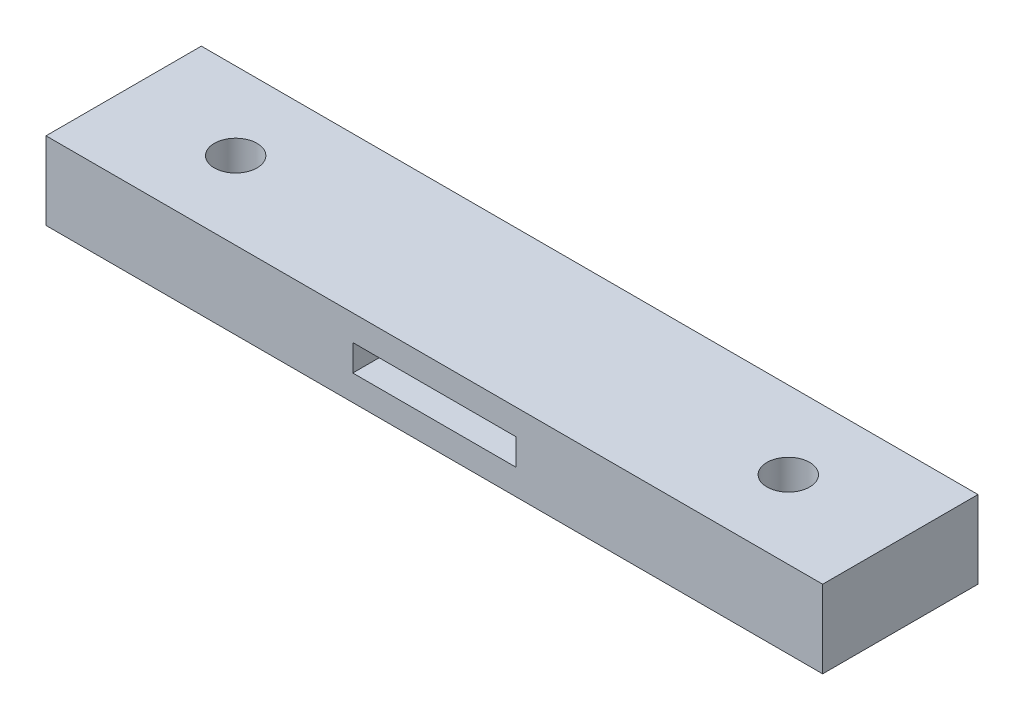
ISO-10303-21;
HEADER;
FILE_DESCRIPTION(('STEP AP214'),'2;1');
FILE_NAME('part.step','',(''),(''),'','','');
FILE_SCHEMA(('AUTOMOTIVE_DESIGN { 1 0 10303 214 1 1 1 1 }'));
ENDSEC;
DATA;
#1=APPLICATION_CONTEXT('core data for automotive mechanical design processes');
#2=APPLICATION_PROTOCOL_DEFINITION('international standard','automotive_design',2000,#1);
#3=PRODUCT_CONTEXT('',#1,'mechanical');
#4=PRODUCT('Part','Part','',(#3));
#5=PRODUCT_RELATED_PRODUCT_CATEGORY('part','',(#4));
#6=PRODUCT_DEFINITION_FORMATION('','',#4);
#7=PRODUCT_DEFINITION_CONTEXT('part definition',#1,'design');
#8=PRODUCT_DEFINITION('design','',#6,#7);
#9=PRODUCT_DEFINITION_SHAPE('','',#8);
#10=(LENGTH_UNIT() NAMED_UNIT(*) SI_UNIT(.MILLI.,.METRE.));
#11=(NAMED_UNIT(*) PLANE_ANGLE_UNIT() SI_UNIT($,.RADIAN.));
#12=(NAMED_UNIT(*) SI_UNIT($,.STERADIAN.) SOLID_ANGLE_UNIT());
#13=UNCERTAINTY_MEASURE_WITH_UNIT(LENGTH_MEASURE(1.E-05),#10,'distance_accuracy_value','');
#14=(GEOMETRIC_REPRESENTATION_CONTEXT(3) GLOBAL_UNCERTAINTY_ASSIGNED_CONTEXT((#13)) GLOBAL_UNIT_ASSIGNED_CONTEXT((#10,
#11,#12)) REPRESENTATION_CONTEXT('',''));
#15=CARTESIAN_POINT('',(0.,0.,0.));
#16=DIRECTION('',(0.,0.,1.));
#17=DIRECTION('',(1.,0.,0.));
#18=AXIS2_PLACEMENT_3D('',#15,#16,#17);
#19=CARTESIAN_POINT('',(0.,0.,25.4));
#20=DIRECTION('',(0.,0.,-1.));
#21=DIRECTION('',(-1.,0.,0.));
#22=AXIS2_PLACEMENT_3D('',#19,#20,#21);
#23=PLANE('',#22);
#24=DIRECTION('',(0.,1.,0.));
#25=VECTOR('',#24,1.);
#26=CARTESIAN_POINT('',(63.5,-6.35,25.4));
#27=LINE('',#26,#25);
#28=CARTESIAN_POINT('',(63.5,-6.35,25.4));
#29=VERTEX_POINT('',#28);
#30=CARTESIAN_POINT('',(63.5,6.35,25.4));
#31=VERTEX_POINT('',#30);
#32=EDGE_CURVE('E136',#29,#31,#27,.T.);
#33=ORIENTED_EDGE('',*,*,#32,.T.);
#34=DIRECTION('',(-1.,0.,0.));
#35=VECTOR('',#34,1.);
#36=CARTESIAN_POINT('',(-63.5,6.35,25.4));
#37=LINE('',#36,#35);
#38=CARTESIAN_POINT('',(-63.5,6.35,25.4));
#39=VERTEX_POINT('',#38);
#40=EDGE_CURVE('E139',#31,#39,#37,.T.);
#41=ORIENTED_EDGE('',*,*,#40,.T.);
#42=DIRECTION('',(0.,-1.,0.));
#43=VECTOR('',#42,1.);
#44=CARTESIAN_POINT('',(-63.5,-6.35,25.4));
#45=LINE('',#44,#43);
#46=CARTESIAN_POINT('',(-63.5,-6.35,25.4));
#47=VERTEX_POINT('',#46);
#48=EDGE_CURVE('E142',#39,#47,#45,.T.);
#49=ORIENTED_EDGE('',*,*,#48,.T.);
#50=DIRECTION('',(1.,0.,0.));
#51=VECTOR('',#50,1.);
#52=CARTESIAN_POINT('',(-63.5,-6.35,25.4));
#53=LINE('',#52,#51);
#54=EDGE_CURVE('E144',#47,#29,#53,.T.);
#55=ORIENTED_EDGE('',*,*,#54,.T.);
#56=EDGE_LOOP('',(#33,#41,#49,#55));
#57=FACE_BOUND('',#56,.T.);
#58=DIRECTION('',(0.,1.,0.));
#59=VECTOR('',#58,1.);
#60=CARTESIAN_POINT('',(13.335,-2.159,25.4));
#61=LINE('',#60,#59);
#62=CARTESIAN_POINT('',(13.335,-2.159,25.4));
#63=VERTEX_POINT('',#62);
#64=CARTESIAN_POINT('',(13.335,2.159,25.4));
#65=VERTEX_POINT('',#64);
#66=EDGE_CURVE('E98',#63,#65,#61,.T.);
#67=ORIENTED_EDGE('',*,*,#66,.F.);
#68=DIRECTION('',(1.,0.,0.));
#69=VECTOR('',#68,1.);
#70=CARTESIAN_POINT('',(-13.335,-2.159,25.4));
#71=LINE('',#70,#69);
#72=CARTESIAN_POINT('',(-13.335,-2.159,25.4));
#73=VERTEX_POINT('',#72);
#74=EDGE_CURVE('E120',#73,#63,#71,.T.);
#75=ORIENTED_EDGE('',*,*,#74,.F.);
#76=DIRECTION('',(0.,-1.,0.));
#77=VECTOR('',#76,1.);
#78=CARTESIAN_POINT('',(-13.335,-2.159,25.4));
#79=LINE('',#78,#77);
#80=CARTESIAN_POINT('',(-13.335,2.159,25.4));
#81=VERTEX_POINT('',#80);
#82=EDGE_CURVE('E118',#81,#73,#79,.T.);
#83=ORIENTED_EDGE('',*,*,#82,.F.);
#84=DIRECTION('',(-1.,0.,0.));
#85=VECTOR('',#84,1.);
#86=CARTESIAN_POINT('',(-13.335,2.159,25.4));
#87=LINE('',#86,#85);
#88=EDGE_CURVE('E106',#65,#81,#87,.T.);
#89=ORIENTED_EDGE('',*,*,#88,.F.);
#90=EDGE_LOOP('',(#67,#75,#83,#89));
#91=FACE_BOUND('',#90,.T.);
#92=ADVANCED_FACE('F33',(#57,#91),#23,.F.);
#93=CARTESIAN_POINT('',(0.,0.,0.));
#94=DIRECTION('',(0.,0.,-1.));
#95=DIRECTION('',(-1.,0.,0.));
#96=AXIS2_PLACEMENT_3D('',#93,#94,#95);
#97=PLANE('',#96);
#98=DIRECTION('',(0.,1.,0.));
#99=VECTOR('',#98,1.);
#100=CARTESIAN_POINT('',(63.5,-6.35,0.));
#101=LINE('',#100,#99);
#102=CARTESIAN_POINT('',(63.5,-6.35,0.));
#103=VERTEX_POINT('',#102);
#104=CARTESIAN_POINT('',(63.5,6.35,0.));
#105=VERTEX_POINT('',#104);
#106=EDGE_CURVE('E114',#103,#105,#101,.T.);
#107=ORIENTED_EDGE('',*,*,#106,.F.);
#108=DIRECTION('',(1.,0.,0.));
#109=VECTOR('',#108,1.);
#110=CARTESIAN_POINT('',(-63.5,-6.35,0.));
#111=LINE('',#110,#109);
#112=CARTESIAN_POINT('',(-63.5,-6.35,0.));
#113=VERTEX_POINT('',#112);
#114=EDGE_CURVE('E140',#113,#103,#111,.T.);
#115=ORIENTED_EDGE('',*,*,#114,.F.);
#116=DIRECTION('',(0.,-1.,0.));
#117=VECTOR('',#116,1.);
#118=CARTESIAN_POINT('',(-63.5,-6.35,0.));
#119=LINE('',#118,#117);
#120=CARTESIAN_POINT('',(-63.5,6.35,0.));
#121=VERTEX_POINT('',#120);
#122=EDGE_CURVE('E151',#121,#113,#119,.T.);
#123=ORIENTED_EDGE('',*,*,#122,.F.);
#124=DIRECTION('',(-1.,0.,0.));
#125=VECTOR('',#124,1.);
#126=CARTESIAN_POINT('',(-63.5,6.35,0.));
#127=LINE('',#126,#125);
#128=EDGE_CURVE('E149',#105,#121,#127,.T.);
#129=ORIENTED_EDGE('',*,*,#128,.F.);
#130=EDGE_LOOP('',(#107,#115,#123,#129));
#131=FACE_BOUND('',#130,.T.);
#132=DIRECTION('',(1.,0.,0.));
#133=VECTOR('',#132,1.);
#134=CARTESIAN_POINT('',(-13.335,-2.159,0.));
#135=LINE('',#134,#133);
#136=CARTESIAN_POINT('',(-13.335,-2.159,0.));
#137=VERTEX_POINT('',#136);
#138=CARTESIAN_POINT('',(13.335,-2.159,0.));
#139=VERTEX_POINT('',#138);
#140=EDGE_CURVE('E107',#137,#139,#135,.T.);
#141=ORIENTED_EDGE('',*,*,#140,.T.);
#142=DIRECTION('',(0.,1.,0.));
#143=VECTOR('',#142,1.);
#144=CARTESIAN_POINT('',(13.335,-2.159,0.));
#145=LINE('',#144,#143);
#146=CARTESIAN_POINT('',(13.335,2.159,0.));
#147=VERTEX_POINT('',#146);
#148=EDGE_CURVE('E56',#139,#147,#145,.T.);
#149=ORIENTED_EDGE('',*,*,#148,.T.);
#150=DIRECTION('',(-1.,0.,0.));
#151=VECTOR('',#150,1.);
#152=CARTESIAN_POINT('',(-13.335,2.159,0.));
#153=LINE('',#152,#151);
#154=CARTESIAN_POINT('',(-13.335,2.159,0.));
#155=VERTEX_POINT('',#154);
#156=EDGE_CURVE('E113',#147,#155,#153,.T.);
#157=ORIENTED_EDGE('',*,*,#156,.T.);
#158=DIRECTION('',(0.,-1.,0.));
#159=VECTOR('',#158,1.);
#160=CARTESIAN_POINT('',(-13.335,-2.159,0.));
#161=LINE('',#160,#159);
#162=EDGE_CURVE('E128',#155,#137,#161,.T.);
#163=ORIENTED_EDGE('',*,*,#162,.T.);
#164=EDGE_LOOP('',(#141,#149,#157,#163));
#165=FACE_BOUND('',#164,.T.);
#166=ADVANCED_FACE('F169',(#131,#165),#97,.T.);
#167=CARTESIAN_POINT('',(63.5,-6.35,25.4));
#168=DIRECTION('',(-1.,0.,0.));
#169=DIRECTION('',(0.,0.,1.));
#170=AXIS2_PLACEMENT_3D('',#167,#168,#169);
#171=PLANE('',#170);
#172=ORIENTED_EDGE('',*,*,#106,.T.);
#173=DIRECTION('',(0.,0.,-1.));
#174=VECTOR('',#173,1.);
#175=CARTESIAN_POINT('',(63.5,6.35,25.4));
#176=LINE('',#175,#174);
#177=EDGE_CURVE('E11',#31,#105,#176,.T.);
#178=ORIENTED_EDGE('',*,*,#177,.F.);
#179=ORIENTED_EDGE('',*,*,#32,.F.);
#180=DIRECTION('',(0.,0.,-1.));
#181=VECTOR('',#180,1.);
#182=CARTESIAN_POINT('',(63.5,-6.35,25.4));
#183=LINE('',#182,#181);
#184=EDGE_CURVE('E146',#29,#103,#183,.T.);
#185=ORIENTED_EDGE('',*,*,#184,.T.);
#186=EDGE_LOOP('',(#172,#178,#179,#185));
#187=FACE_BOUND('',#186,.T.);
#188=ADVANCED_FACE('F35',(#187),#171,.F.);
#189=CARTESIAN_POINT('',(-63.5,6.35,25.4));
#190=DIRECTION('',(0.,-1.,0.));
#191=DIRECTION('',(0.,0.,-1.));
#192=AXIS2_PLACEMENT_3D('',#189,#190,#191);
#193=PLANE('',#192);
#194=CARTESIAN_POINT('',(45.1845411120777,6.35,12.7));
#195=DIRECTION('',(0.,1.,0.));
#196=DIRECTION('',(0.,0.,1.));
#197=AXIS2_PLACEMENT_3D('',#194,#195,#196);
#198=CIRCLE('',#197,3.49250000000001);
#199=CARTESIAN_POINT('',(45.1845411120777,6.35,16.1925));
#200=VERTEX_POINT('',#199);
#201=EDGE_CURVE('E210',#200,#200,#198,.T.);
#202=ORIENTED_EDGE('',*,*,#201,.F.);
#203=EDGE_LOOP('',(#202));
#204=FACE_BOUND('',#203,.T.);
#205=CARTESIAN_POINT('',(-45.1845411120777,6.35,12.7));
#206=DIRECTION('',(0.,1.,0.));
#207=DIRECTION('',(0.,0.,1.));
#208=AXIS2_PLACEMENT_3D('',#205,#206,#207);
#209=CIRCLE('',#208,3.49250000000001);
#210=CARTESIAN_POINT('',(-45.1845411120777,6.35,16.1925));
#211=VERTEX_POINT('',#210);
#212=EDGE_CURVE('E211',#211,#211,#209,.T.);
#213=ORIENTED_EDGE('',*,*,#212,.F.);
#214=EDGE_LOOP('',(#213));
#215=FACE_BOUND('',#214,.T.);
#216=ORIENTED_EDGE('',*,*,#128,.T.);
#217=DIRECTION('',(0.,0.,-1.));
#218=VECTOR('',#217,1.);
#219=CARTESIAN_POINT('',(-63.5,6.35,25.4));
#220=LINE('',#219,#218);
#221=EDGE_CURVE('E41',#39,#121,#220,.T.);
#222=ORIENTED_EDGE('',*,*,#221,.F.);
#223=ORIENTED_EDGE('',*,*,#40,.F.);
#224=ORIENTED_EDGE('',*,*,#177,.T.);
#225=EDGE_LOOP('',(#216,#222,#223,#224));
#226=FACE_BOUND('',#225,.T.);
#227=ADVANCED_FACE('F179',(#204,#215,#226),#193,.F.);
#228=CARTESIAN_POINT('',(-63.5,-6.35,25.4));
#229=DIRECTION('',(1.,0.,0.));
#230=DIRECTION('',(0.,0.,-1.));
#231=AXIS2_PLACEMENT_3D('',#228,#229,#230);
#232=PLANE('',#231);
#233=ORIENTED_EDGE('',*,*,#122,.T.);
#234=DIRECTION('',(0.,0.,-1.));
#235=VECTOR('',#234,1.);
#236=CARTESIAN_POINT('',(-63.5,-6.35,25.4));
#237=LINE('',#236,#235);
#238=EDGE_CURVE('E156',#47,#113,#237,.T.);
#239=ORIENTED_EDGE('',*,*,#238,.F.);
#240=ORIENTED_EDGE('',*,*,#48,.F.);
#241=ORIENTED_EDGE('',*,*,#221,.T.);
#242=EDGE_LOOP('',(#233,#239,#240,#241));
#243=FACE_BOUND('',#242,.T.);
#244=ADVANCED_FACE('F163',(#243),#232,.F.);
#245=CARTESIAN_POINT('',(-63.5,-6.35,25.4));
#246=DIRECTION('',(0.,1.,0.));
#247=DIRECTION('',(0.,0.,1.));
#248=AXIS2_PLACEMENT_3D('',#245,#246,#247);
#249=PLANE('',#248);
#250=CARTESIAN_POINT('',(45.1845411120777,-6.35,12.7));
#251=DIRECTION('',(0.,1.,0.));
#252=DIRECTION('',(0.,0.,1.));
#253=AXIS2_PLACEMENT_3D('',#250,#251,#252);
#254=CIRCLE('',#253,3.49250000000001);
#255=CARTESIAN_POINT('',(45.1845411120777,-6.35,16.1925));
#256=VERTEX_POINT('',#255);
#257=EDGE_CURVE('E126',#256,#256,#254,.T.);
#258=ORIENTED_EDGE('',*,*,#257,.T.);
#259=EDGE_LOOP('',(#258));
#260=FACE_BOUND('',#259,.T.);
#261=CARTESIAN_POINT('',(-45.1845411120777,-6.35,12.7));
#262=DIRECTION('',(0.,1.,0.));
#263=DIRECTION('',(0.,0.,1.));
#264=AXIS2_PLACEMENT_3D('',#261,#262,#263);
#265=CIRCLE('',#264,3.49250000000001);
#266=CARTESIAN_POINT('',(-45.1845411120777,-6.35,16.1925));
#267=VERTEX_POINT('',#266);
#268=EDGE_CURVE('E208',#267,#267,#265,.T.);
#269=ORIENTED_EDGE('',*,*,#268,.T.);
#270=EDGE_LOOP('',(#269));
#271=FACE_BOUND('',#270,.T.);
#272=ORIENTED_EDGE('',*,*,#114,.T.);
#273=ORIENTED_EDGE('',*,*,#184,.F.);
#274=ORIENTED_EDGE('',*,*,#54,.F.);
#275=ORIENTED_EDGE('',*,*,#238,.T.);
#276=EDGE_LOOP('',(#272,#273,#274,#275));
#277=FACE_BOUND('',#276,.T.);
#278=ADVANCED_FACE('F173',(#260,#271,#277),#249,.F.);
#279=CARTESIAN_POINT('',(13.335,-2.159,25.4));
#280=DIRECTION('',(-1.,0.,0.));
#281=DIRECTION('',(0.,0.,1.));
#282=AXIS2_PLACEMENT_3D('',#279,#280,#281);
#283=PLANE('',#282);
#284=ORIENTED_EDGE('',*,*,#148,.F.);
#285=DIRECTION('',(0.,0.,-1.));
#286=VECTOR('',#285,1.);
#287=CARTESIAN_POINT('',(13.335,-2.159,25.4));
#288=LINE('',#287,#286);
#289=EDGE_CURVE('E102',#63,#139,#288,.T.);
#290=ORIENTED_EDGE('',*,*,#289,.F.);
#291=ORIENTED_EDGE('',*,*,#66,.T.);
#292=DIRECTION('',(0.,0.,-1.));
#293=VECTOR('',#292,1.);
#294=CARTESIAN_POINT('',(13.335,2.159,25.4));
#295=LINE('',#294,#293);
#296=EDGE_CURVE('E101',#65,#147,#295,.T.);
#297=ORIENTED_EDGE('',*,*,#296,.T.);
#298=EDGE_LOOP('',(#284,#290,#291,#297));
#299=FACE_BOUND('',#298,.T.);
#300=ADVANCED_FACE('F100',(#299),#283,.T.);
#301=CARTESIAN_POINT('',(-13.335,2.159,25.4));
#302=DIRECTION('',(0.,-1.,0.));
#303=DIRECTION('',(0.,0.,-1.));
#304=AXIS2_PLACEMENT_3D('',#301,#302,#303);
#305=PLANE('',#304);
#306=ORIENTED_EDGE('',*,*,#156,.F.);
#307=ORIENTED_EDGE('',*,*,#296,.F.);
#308=ORIENTED_EDGE('',*,*,#88,.T.);
#309=DIRECTION('',(0.,0.,-1.));
#310=VECTOR('',#309,1.);
#311=CARTESIAN_POINT('',(-13.335,2.159,25.4));
#312=LINE('',#311,#310);
#313=EDGE_CURVE('E115',#81,#155,#312,.T.);
#314=ORIENTED_EDGE('',*,*,#313,.T.);
#315=EDGE_LOOP('',(#306,#307,#308,#314));
#316=FACE_BOUND('',#315,.T.);
#317=ADVANCED_FACE('F110',(#316),#305,.T.);
#318=CARTESIAN_POINT('',(-13.335,-2.159,25.4));
#319=DIRECTION('',(1.,0.,0.));
#320=DIRECTION('',(0.,0.,-1.));
#321=AXIS2_PLACEMENT_3D('',#318,#319,#320);
#322=PLANE('',#321);
#323=ORIENTED_EDGE('',*,*,#162,.F.);
#324=ORIENTED_EDGE('',*,*,#313,.F.);
#325=ORIENTED_EDGE('',*,*,#82,.T.);
#326=DIRECTION('',(0.,0.,-1.));
#327=VECTOR('',#326,1.);
#328=CARTESIAN_POINT('',(-13.335,-2.159,25.4));
#329=LINE('',#328,#327);
#330=EDGE_CURVE('E48',#73,#137,#329,.T.);
#331=ORIENTED_EDGE('',*,*,#330,.T.);
#332=EDGE_LOOP('',(#323,#324,#325,#331));
#333=FACE_BOUND('',#332,.T.);
#334=ADVANCED_FACE('F230',(#333),#322,.T.);
#335=CARTESIAN_POINT('',(-13.335,-2.159,25.4));
#336=DIRECTION('',(0.,1.,0.));
#337=DIRECTION('',(0.,0.,1.));
#338=AXIS2_PLACEMENT_3D('',#335,#336,#337);
#339=PLANE('',#338);
#340=ORIENTED_EDGE('',*,*,#140,.F.);
#341=ORIENTED_EDGE('',*,*,#330,.F.);
#342=ORIENTED_EDGE('',*,*,#74,.T.);
#343=ORIENTED_EDGE('',*,*,#289,.T.);
#344=EDGE_LOOP('',(#340,#341,#342,#343));
#345=FACE_BOUND('',#344,.T.);
#346=ADVANCED_FACE('F222',(#345),#339,.T.);
#347=CARTESIAN_POINT('',(-45.1845411120777,-6.35,12.7));
#348=DIRECTION('',(0.,1.,0.));
#349=DIRECTION('',(0.,0.,1.));
#350=AXIS2_PLACEMENT_3D('',#347,#348,#349);
#351=CYLINDRICAL_SURFACE('',#350,3.49250000000001);
#352=ORIENTED_EDGE('',*,*,#268,.F.);
#353=EDGE_LOOP('',(#352));
#354=FACE_BOUND('',#353,.T.);
#355=ORIENTED_EDGE('',*,*,#212,.T.);
#356=EDGE_LOOP('',(#355));
#357=FACE_BOUND('',#356,.T.);
#358=ADVANCED_FACE('F219',(#354,#357),#351,.F.);
#359=CARTESIAN_POINT('',(45.1845411120777,-6.35,12.7));
#360=DIRECTION('',(0.,1.,0.));
#361=DIRECTION('',(0.,0.,1.));
#362=AXIS2_PLACEMENT_3D('',#359,#360,#361);
#363=CYLINDRICAL_SURFACE('',#362,3.49250000000001);
#364=ORIENTED_EDGE('',*,*,#257,.F.);
#365=EDGE_LOOP('',(#364));
#366=FACE_BOUND('',#365,.T.);
#367=ORIENTED_EDGE('',*,*,#201,.T.);
#368=EDGE_LOOP('',(#367));
#369=FACE_BOUND('',#368,.T.);
#370=ADVANCED_FACE('F221',(#366,#369),#363,.F.);
#371=CLOSED_SHELL('',(#92,#166,#188,#227,#244,#278,#300,#317,#334,#346,#358,#370));
#372=MANIFOLD_SOLID_BREP('B2',#371);
#373=ADVANCED_BREP_SHAPE_REPRESENTATION('',(#18,#372),#14);
#374=SHAPE_DEFINITION_REPRESENTATION(#9,#373);
ENDSEC;
END-ISO-10303-21;
